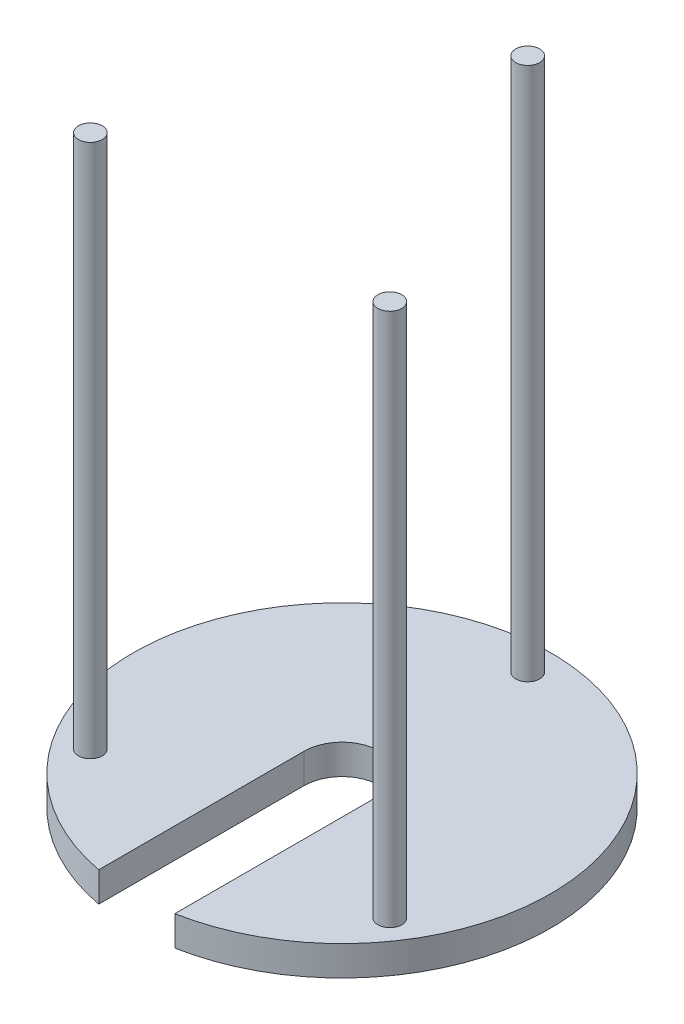
ISO-10303-21;
HEADER;
FILE_DESCRIPTION(('STEP AP214'),'2;1');
FILE_NAME('part.step','',(''),(''),'','','');
FILE_SCHEMA(('AUTOMOTIVE_DESIGN { 1 0 10303 214 1 1 1 1 }'));
ENDSEC;
DATA;
#1=APPLICATION_CONTEXT('core data for automotive mechanical design processes');
#2=APPLICATION_PROTOCOL_DEFINITION('international standard','automotive_design',2000,#1);
#3=PRODUCT_CONTEXT('',#1,'mechanical');
#4=PRODUCT('Part','Part','',(#3));
#5=PRODUCT_RELATED_PRODUCT_CATEGORY('part','',(#4));
#6=PRODUCT_DEFINITION_FORMATION('','',#4);
#7=PRODUCT_DEFINITION_CONTEXT('part definition',#1,'design');
#8=PRODUCT_DEFINITION('design','',#6,#7);
#9=PRODUCT_DEFINITION_SHAPE('','',#8);
#10=(LENGTH_UNIT() NAMED_UNIT(*) SI_UNIT(.MILLI.,.METRE.));
#11=(NAMED_UNIT(*) PLANE_ANGLE_UNIT() SI_UNIT($,.RADIAN.));
#12=(NAMED_UNIT(*) SI_UNIT($,.STERADIAN.) SOLID_ANGLE_UNIT());
#13=UNCERTAINTY_MEASURE_WITH_UNIT(LENGTH_MEASURE(1.E-05),#10,'distance_accuracy_value','');
#14=(GEOMETRIC_REPRESENTATION_CONTEXT(3) GLOBAL_UNCERTAINTY_ASSIGNED_CONTEXT((#13)) GLOBAL_UNIT_ASSIGNED_CONTEXT((#10,
#11,#12)) REPRESENTATION_CONTEXT('',''));
#15=CARTESIAN_POINT('',(0.,0.,0.));
#16=DIRECTION('',(0.,0.,1.));
#17=DIRECTION('',(1.,0.,0.));
#18=AXIS2_PLACEMENT_3D('',#15,#16,#17);
#19=CARTESIAN_POINT('',(0.,10.,0.));
#20=DIRECTION('',(0.,-1.,0.));
#21=DIRECTION('',(0.,0.,-1.));
#22=AXIS2_PLACEMENT_3D('',#19,#20,#21);
#23=CYLINDRICAL_SURFACE('',#22,70.);
#24=DIRECTION('',(0.,-1.,0.));
#25=VECTOR('',#24,1.);
#26=CARTESIAN_POINT('',(12.75,10.,68.8290454677384));
#27=LINE('',#26,#25);
#28=CARTESIAN_POINT('',(12.75,0.,68.8290454677384));
#29=VERTEX_POINT('',#28);
#30=CARTESIAN_POINT('',(12.75,10.,68.8290454677384));
#31=VERTEX_POINT('',#30);
#32=EDGE_CURVE('E116',#29,#31,#27,.F.);
#33=ORIENTED_EDGE('',*,*,#32,.F.);
#34=CARTESIAN_POINT('',(0.,0.,0.));
#35=DIRECTION('',(0.,1.,0.));
#36=DIRECTION('',(0.,0.,1.));
#37=AXIS2_PLACEMENT_3D('',#34,#35,#36);
#38=CIRCLE('',#37,70.);
#39=CARTESIAN_POINT('',(-12.75,0.,68.8290454677384));
#40=VERTEX_POINT('',#39);
#41=EDGE_CURVE('E63',#29,#40,#38,.T.);
#42=ORIENTED_EDGE('',*,*,#41,.T.);
#43=DIRECTION('',(0.,-1.,0.));
#44=VECTOR('',#43,1.);
#45=CARTESIAN_POINT('',(-12.75,10.,68.8290454677384));
#46=LINE('',#45,#44);
#47=CARTESIAN_POINT('',(-12.75,10.,68.8290454677384));
#48=VERTEX_POINT('',#47);
#49=EDGE_CURVE('E75',#40,#48,#46,.F.);
#50=ORIENTED_EDGE('',*,*,#49,.T.);
#51=CARTESIAN_POINT('',(0.,10.,0.));
#52=DIRECTION('',(0.,1.,0.));
#53=DIRECTION('',(0.,0.,1.));
#54=AXIS2_PLACEMENT_3D('',#51,#52,#53);
#55=CIRCLE('',#54,70.);
#56=EDGE_CURVE('E12',#31,#48,#55,.T.);
#57=ORIENTED_EDGE('',*,*,#56,.F.);
#58=EDGE_LOOP('',(#33,#42,#50,#57));
#59=FACE_BOUND('',#58,.T.);
#60=ADVANCED_FACE('F60',(#59),#23,.T.);
#61=CARTESIAN_POINT('',(0.,10.,0.));
#62=DIRECTION('',(0.,1.,0.));
#63=DIRECTION('',(0.,0.,1.));
#64=AXIS2_PLACEMENT_3D('',#61,#62,#63);
#65=PLANE('',#64);
#66=CARTESIAN_POINT('',(-49.2264981599708,10.,35.171037501137));
#67=DIRECTION('',(0.,1.,0.));
#68=DIRECTION('',(0.,0.,1.));
#69=AXIS2_PLACEMENT_3D('',#66,#67,#68);
#70=CIRCLE('',#69,4.00000000000001);
#71=CARTESIAN_POINT('',(-49.2264981599708,9.99999999999998,31.171037501137));
#72=VERTEX_POINT('',#71);
#73=EDGE_CURVE('E146',#72,#72,#70,.T.);
#74=ORIENTED_EDGE('',*,*,#73,.F.);
#75=EDGE_LOOP('',(#74));
#76=FACE_BOUND('',#75,.T.);
#77=CARTESIAN_POINT('',(1.7675282556702,10.,-60.5));
#78=DIRECTION('',(0.,1.,0.));
#79=DIRECTION('',(0.,0.,1.));
#80=AXIS2_PLACEMENT_3D('',#77,#78,#79);
#81=CIRCLE('',#80,4.);
#82=CARTESIAN_POINT('',(1.7675282556702,9.99999999999998,-64.5));
#83=VERTEX_POINT('',#82);
#84=EDGE_CURVE('E150',#83,#83,#81,.T.);
#85=ORIENTED_EDGE('',*,*,#84,.F.);
#86=EDGE_LOOP('',(#85));
#87=FACE_BOUND('',#86,.T.);
#88=CARTESIAN_POINT('',(50.0353405978836,10.,34.0105085415344));
#89=DIRECTION('',(0.,1.,0.));
#90=DIRECTION('',(0.,0.,1.));
#91=AXIS2_PLACEMENT_3D('',#88,#89,#90);
#92=CIRCLE('',#91,4.00000000000001);
#93=CARTESIAN_POINT('',(50.0353405978836,9.99999999999998,30.0105085415344));
#94=VERTEX_POINT('',#93);
#95=EDGE_CURVE('E158',#94,#94,#92,.T.);
#96=ORIENTED_EDGE('',*,*,#95,.F.);
#97=EDGE_LOOP('',(#96));
#98=FACE_BOUND('',#97,.T.);
#99=CARTESIAN_POINT('',(0.,10.,0.));
#100=DIRECTION('',(0.,1.,0.));
#101=DIRECTION('',(0.,0.,1.));
#102=AXIS2_PLACEMENT_3D('',#99,#100,#101);
#103=CIRCLE('',#102,12.75);
#104=CARTESIAN_POINT('',(12.75,10.,0.));
#105=VERTEX_POINT('',#104);
#106=CARTESIAN_POINT('',(-12.75,10.,0.));
#107=VERTEX_POINT('',#106);
#108=EDGE_CURVE('E106',#105,#107,#103,.T.);
#109=ORIENTED_EDGE('',*,*,#108,.F.);
#110=DIRECTION('',(0.,0.,1.));
#111=VECTOR('',#110,1.);
#112=CARTESIAN_POINT('',(12.75,10.,0.));
#113=LINE('',#112,#111);
#114=EDGE_CURVE('E114',#105,#31,#113,.T.);
#115=ORIENTED_EDGE('',*,*,#114,.T.);
#116=ORIENTED_EDGE('',*,*,#56,.T.);
#117=DIRECTION('',(0.,0.,1.));
#118=VECTOR('',#117,1.);
#119=CARTESIAN_POINT('',(-12.75,10.,0.));
#120=LINE('',#119,#118);
#121=EDGE_CURVE('E120',#107,#48,#120,.T.);
#122=ORIENTED_EDGE('',*,*,#121,.F.);
#123=EDGE_LOOP('',(#109,#115,#116,#122));
#124=FACE_BOUND('',#123,.T.);
#125=ADVANCED_FACE('F122',(#76,#87,#98,#124),#65,.T.);
#126=CARTESIAN_POINT('',(0.,0.,0.));
#127=DIRECTION('',(0.,1.,0.));
#128=DIRECTION('',(0.,0.,1.));
#129=AXIS2_PLACEMENT_3D('',#126,#127,#128);
#130=PLANE('',#129);
#131=DIRECTION('',(0.,0.,1.));
#132=VECTOR('',#131,1.);
#133=CARTESIAN_POINT('',(12.75,0.,0.));
#134=LINE('',#133,#132);
#135=CARTESIAN_POINT('',(12.75,0.,0.));
#136=VERTEX_POINT('',#135);
#137=EDGE_CURVE('E83',#136,#29,#134,.T.);
#138=ORIENTED_EDGE('',*,*,#137,.F.);
#139=CARTESIAN_POINT('',(0.,0.,0.));
#140=DIRECTION('',(0.,1.,0.));
#141=DIRECTION('',(0.,0.,1.));
#142=AXIS2_PLACEMENT_3D('',#139,#140,#141);
#143=CIRCLE('',#142,12.75);
#144=CARTESIAN_POINT('',(-12.75,0.,0.));
#145=VERTEX_POINT('',#144);
#146=EDGE_CURVE('E109',#136,#145,#143,.T.);
#147=ORIENTED_EDGE('',*,*,#146,.T.);
#148=DIRECTION('',(0.,0.,1.));
#149=VECTOR('',#148,1.);
#150=CARTESIAN_POINT('',(-12.75,0.,0.));
#151=LINE('',#150,#149);
#152=EDGE_CURVE('E124',#145,#40,#151,.T.);
#153=ORIENTED_EDGE('',*,*,#152,.T.);
#154=ORIENTED_EDGE('',*,*,#41,.F.);
#155=EDGE_LOOP('',(#138,#147,#153,#154));
#156=FACE_BOUND('',#155,.T.);
#157=ADVANCED_FACE('F171',(#156),#130,.F.);
#158=CARTESIAN_POINT('',(50.0353405978836,189.,34.0105085415344));
#159=DIRECTION('',(0.,-1.,0.));
#160=DIRECTION('',(0.,0.,-1.));
#161=AXIS2_PLACEMENT_3D('',#158,#159,#160);
#162=CYLINDRICAL_SURFACE('',#161,4.00000000000001);
#163=CARTESIAN_POINT('',(50.0353405978836,189.,34.0105085415344));
#164=DIRECTION('',(0.,1.,0.));
#165=DIRECTION('',(0.,0.,1.));
#166=AXIS2_PLACEMENT_3D('',#163,#164,#165);
#167=CIRCLE('',#166,4.00000000000001);
#168=CARTESIAN_POINT('',(50.0353405978836,189.,30.0105085415344));
#169=VERTEX_POINT('',#168);
#170=EDGE_CURVE('E141',#169,#169,#167,.T.);
#171=CARTESIAN_POINT('',(50.0353405978836,189.,30.0105085415344));
#172=CARTESIAN_POINT('',(50.0353405978836,187.135416666667,30.0105085415344));
#173=CARTESIAN_POINT('',(50.0353405978836,185.270833333333,30.0105085415344));
#174=CARTESIAN_POINT('',(50.0353405978836,181.541666666667,30.0105085415344));
#175=CARTESIAN_POINT('',(50.0353405978836,179.677083333333,30.0105085415344));
#176=CARTESIAN_POINT('',(50.0353405978836,175.947916666667,30.0105085415344));
#177=CARTESIAN_POINT('',(50.0353405978836,174.083333333333,30.0105085415344));
#178=CARTESIAN_POINT('',(50.0353405978836,170.354166666667,30.0105085415344));
#179=CARTESIAN_POINT('',(50.0353405978836,168.489583333333,30.0105085415344));
#180=CARTESIAN_POINT('',(50.0353405978836,164.760416666667,30.0105085415344));
#181=CARTESIAN_POINT('',(50.0353405978836,162.895833333333,30.0105085415344));
#182=CARTESIAN_POINT('',(50.0353405978836,159.166666666667,30.0105085415344));
#183=CARTESIAN_POINT('',(50.0353405978836,157.302083333333,30.0105085415344));
#184=CARTESIAN_POINT('',(50.0353405978836,153.572916666667,30.0105085415344));
#185=CARTESIAN_POINT('',(50.0353405978836,151.708333333333,30.0105085415344));
#186=CARTESIAN_POINT('',(50.0353405978836,147.979166666667,30.0105085415344));
#187=CARTESIAN_POINT('',(50.0353405978836,146.114583333333,30.0105085415344));
#188=CARTESIAN_POINT('',(50.0353405978836,142.385416666667,30.0105085415344));
#189=CARTESIAN_POINT('',(50.0353405978836,140.520833333333,30.0105085415344));
#190=CARTESIAN_POINT('',(50.0353405978836,136.791666666667,30.0105085415344));
#191=CARTESIAN_POINT('',(50.0353405978836,134.927083333333,30.0105085415344));
#192=CARTESIAN_POINT('',(50.0353405978836,131.197916666667,30.0105085415344));
#193=CARTESIAN_POINT('',(50.0353405978836,129.333333333333,30.0105085415344));
#194=CARTESIAN_POINT('',(50.0353405978836,125.604166666667,30.0105085415344));
#195=CARTESIAN_POINT('',(50.0353405978836,123.739583333333,30.0105085415344));
#196=CARTESIAN_POINT('',(50.0353405978836,120.010416666667,30.0105085415344));
#197=CARTESIAN_POINT('',(50.0353405978836,118.145833333333,30.0105085415344));
#198=CARTESIAN_POINT('',(50.0353405978836,114.416666666667,30.0105085415344));
#199=CARTESIAN_POINT('',(50.0353405978836,112.552083333333,30.0105085415344));
#200=CARTESIAN_POINT('',(50.0353405978836,108.822916666667,30.0105085415344));
#201=CARTESIAN_POINT('',(50.0353405978836,106.958333333333,30.0105085415344));
#202=CARTESIAN_POINT('',(50.0353405978836,103.229166666667,30.0105085415344));
#203=CARTESIAN_POINT('',(50.0353405978836,101.364583333333,30.0105085415344));
#204=CARTESIAN_POINT('',(50.0353405978836,97.6354166666666,30.0105085415344));
#205=CARTESIAN_POINT('',(50.0353405978836,95.7708333333333,30.0105085415344));
#206=CARTESIAN_POINT('',(50.0353405978836,92.0416666666666,30.0105085415344));
#207=CARTESIAN_POINT('',(50.0353405978836,90.1770833333333,30.0105085415344));
#208=CARTESIAN_POINT('',(50.0353405978836,86.4479166666666,30.0105085415344));
#209=CARTESIAN_POINT('',(50.0353405978836,84.5833333333333,30.0105085415344));
#210=CARTESIAN_POINT('',(50.0353405978836,80.8541666666666,30.0105085415344));
#211=CARTESIAN_POINT('',(50.0353405978836,78.9895833333333,30.0105085415344));
#212=CARTESIAN_POINT('',(50.0353405978836,75.2604166666666,30.0105085415344));
#213=CARTESIAN_POINT('',(50.0353405978836,73.3958333333333,30.0105085415344));
#214=CARTESIAN_POINT('',(50.0353405978836,69.6666666666666,30.0105085415344));
#215=CARTESIAN_POINT('',(50.0353405978836,67.8020833333333,30.0105085415344));
#216=CARTESIAN_POINT('',(50.0353405978836,64.0729166666666,30.0105085415344));
#217=CARTESIAN_POINT('',(50.0353405978836,62.2083333333333,30.0105085415344));
#218=CARTESIAN_POINT('',(50.0353405978836,58.4791666666667,30.0105085415344));
#219=CARTESIAN_POINT('',(50.0353405978836,56.6145833333333,30.0105085415344));
#220=CARTESIAN_POINT('',(50.0353405978836,52.8854166666667,30.0105085415344));
#221=CARTESIAN_POINT('',(50.0353405978836,51.0208333333333,30.0105085415344));
#222=CARTESIAN_POINT('',(50.0353405978836,47.2916666666667,30.0105085415344));
#223=CARTESIAN_POINT('',(50.0353405978836,45.4270833333333,30.0105085415344));
#224=CARTESIAN_POINT('',(50.0353405978836,41.6979166666667,30.0105085415344));
#225=CARTESIAN_POINT('',(50.0353405978836,39.8333333333333,30.0105085415344));
#226=CARTESIAN_POINT('',(50.0353405978836,36.1041666666667,30.0105085415344));
#227=CARTESIAN_POINT('',(50.0353405978836,34.2395833333333,30.0105085415344));
#228=CARTESIAN_POINT('',(50.0353405978836,30.5104166666667,30.0105085415344));
#229=CARTESIAN_POINT('',(50.0353405978836,28.6458333333333,30.0105085415344));
#230=CARTESIAN_POINT('',(50.0353405978836,24.9166666666667,30.0105085415344));
#231=CARTESIAN_POINT('',(50.0353405978836,23.0520833333333,30.0105085415344));
#232=CARTESIAN_POINT('',(50.0353405978836,19.3229166666667,30.0105085415344));
#233=CARTESIAN_POINT('',(50.0353405978836,17.4583333333333,30.0105085415344));
#234=CARTESIAN_POINT('',(50.0353405978836,13.7291666666667,30.0105085415344));
#235=CARTESIAN_POINT('',(50.0353405978836,11.8645833333333,30.0105085415344));
#236=CARTESIAN_POINT('',(50.0353405978836,9.99999999999998,30.0105085415344));
#237=B_SPLINE_CURVE_WITH_KNOTS('',3,(#171,#172,#173,#174,#175,#176,#177,#178,#179,#180,#181,
#182,#183,#184,#185,#186,#187,#188,#189,#190,#191,#192,#193,#194,#195,#196,#197,#198,#199,#200,
#201,#202,#203,#204,#205,#206,#207,#208,#209,#210,#211,#212,#213,#214,#215,#216,#217,#218,#219,
#220,#221,#222,#223,#224,#225,#226,#227,#228,#229,#230,#231,#232,#233,#234,#235,#236),
.UNSPECIFIED.,.F.,.F.,(4,2,2,2,2,2,2,2,2,2,2,2,2,2,2,2,2,2,2,2,2,2,2,2,2,2,2,2,2,2,2,2,4),(0.,
5.59375000000001,11.1875,16.78125,22.375,27.96875,33.5625,39.15625,44.75,50.34375,55.9375,
61.53125,67.125,72.71875,78.3125,83.90625,89.5,95.09375,100.6875,106.28125,111.875,117.46875,
123.0625,128.65625,134.25,139.84375,145.4375,151.03125,156.625,162.21875,167.8125,173.40625,
179.),.UNSPECIFIED.);
#238=EDGE_CURVE('BSEAM168',#169,#94,#237,.T.);
#239=ORIENTED_EDGE('',*,*,#170,.F.);
#240=ORIENTED_EDGE('',*,*,#95,.T.);
#241=ORIENTED_EDGE('',*,*,#238,.T.);
#242=ORIENTED_EDGE('',*,*,#238,.F.);
#243=EDGE_LOOP('',(#239,#241,#240,#242));
#244=FACE_BOUND('',#243,.T.);
#245=ADVANCED_FACE('F168',(#244),#162,.T.);
#246=CARTESIAN_POINT('',(50.0353405978836,189.,34.0105085415344));
#247=DIRECTION('',(0.,1.,0.));
#248=DIRECTION('',(0.,0.,1.));
#249=AXIS2_PLACEMENT_3D('',#246,#247,#248);
#250=PLANE('',#249);
#251=ORIENTED_EDGE('',*,*,#170,.T.);
#252=EDGE_LOOP('',(#251));
#253=FACE_BOUND('',#252,.T.);
#254=ADVANCED_FACE('F166',(#253),#250,.T.);
#255=CARTESIAN_POINT('',(1.7675282556702,189.,-60.5));
#256=DIRECTION('',(0.,-1.,0.));
#257=DIRECTION('',(0.,0.,-1.));
#258=AXIS2_PLACEMENT_3D('',#255,#256,#257);
#259=CYLINDRICAL_SURFACE('',#258,4.);
#260=CARTESIAN_POINT('',(1.7675282556702,189.,-60.5));
#261=DIRECTION('',(0.,1.,0.));
#262=DIRECTION('',(0.,0.,1.));
#263=AXIS2_PLACEMENT_3D('',#260,#261,#262);
#264=CIRCLE('',#263,4.);
#265=CARTESIAN_POINT('',(1.7675282556702,189.,-64.5));
#266=VERTEX_POINT('',#265);
#267=EDGE_CURVE('E154',#266,#266,#264,.T.);
#268=CARTESIAN_POINT('',(1.7675282556702,189.,-64.5));
#269=CARTESIAN_POINT('',(1.7675282556702,187.135416666667,-64.5));
#270=CARTESIAN_POINT('',(1.7675282556702,185.270833333333,-64.5));
#271=CARTESIAN_POINT('',(1.7675282556702,181.541666666667,-64.5));
#272=CARTESIAN_POINT('',(1.7675282556702,179.677083333333,-64.5));
#273=CARTESIAN_POINT('',(1.7675282556702,175.947916666667,-64.5));
#274=CARTESIAN_POINT('',(1.7675282556702,174.083333333333,-64.5));
#275=CARTESIAN_POINT('',(1.7675282556702,170.354166666667,-64.5));
#276=CARTESIAN_POINT('',(1.7675282556702,168.489583333333,-64.5));
#277=CARTESIAN_POINT('',(1.7675282556702,164.760416666667,-64.5));
#278=CARTESIAN_POINT('',(1.7675282556702,162.895833333333,-64.5));
#279=CARTESIAN_POINT('',(1.7675282556702,159.166666666667,-64.5));
#280=CARTESIAN_POINT('',(1.7675282556702,157.302083333333,-64.5));
#281=CARTESIAN_POINT('',(1.7675282556702,153.572916666667,-64.5));
#282=CARTESIAN_POINT('',(1.7675282556702,151.708333333333,-64.5));
#283=CARTESIAN_POINT('',(1.7675282556702,147.979166666667,-64.5));
#284=CARTESIAN_POINT('',(1.7675282556702,146.114583333333,-64.5));
#285=CARTESIAN_POINT('',(1.7675282556702,142.385416666667,-64.5));
#286=CARTESIAN_POINT('',(1.7675282556702,140.520833333333,-64.5));
#287=CARTESIAN_POINT('',(1.7675282556702,136.791666666667,-64.5));
#288=CARTESIAN_POINT('',(1.7675282556702,134.927083333333,-64.5));
#289=CARTESIAN_POINT('',(1.7675282556702,131.197916666667,-64.5));
#290=CARTESIAN_POINT('',(1.7675282556702,129.333333333333,-64.5));
#291=CARTESIAN_POINT('',(1.7675282556702,125.604166666667,-64.5));
#292=CARTESIAN_POINT('',(1.7675282556702,123.739583333333,-64.5));
#293=CARTESIAN_POINT('',(1.7675282556702,120.010416666667,-64.5));
#294=CARTESIAN_POINT('',(1.7675282556702,118.145833333333,-64.5));
#295=CARTESIAN_POINT('',(1.7675282556702,114.416666666667,-64.5));
#296=CARTESIAN_POINT('',(1.7675282556702,112.552083333333,-64.5));
#297=CARTESIAN_POINT('',(1.7675282556702,108.822916666667,-64.5));
#298=CARTESIAN_POINT('',(1.7675282556702,106.958333333333,-64.5));
#299=CARTESIAN_POINT('',(1.7675282556702,103.229166666667,-64.5));
#300=CARTESIAN_POINT('',(1.7675282556702,101.364583333333,-64.5));
#301=CARTESIAN_POINT('',(1.7675282556702,97.6354166666666,-64.5));
#302=CARTESIAN_POINT('',(1.7675282556702,95.7708333333333,-64.5));
#303=CARTESIAN_POINT('',(1.7675282556702,92.0416666666666,-64.5));
#304=CARTESIAN_POINT('',(1.7675282556702,90.1770833333333,-64.5));
#305=CARTESIAN_POINT('',(1.7675282556702,86.4479166666666,-64.5));
#306=CARTESIAN_POINT('',(1.7675282556702,84.5833333333333,-64.5));
#307=CARTESIAN_POINT('',(1.7675282556702,80.8541666666666,-64.5));
#308=CARTESIAN_POINT('',(1.7675282556702,78.9895833333333,-64.5));
#309=CARTESIAN_POINT('',(1.7675282556702,75.2604166666666,-64.5));
#310=CARTESIAN_POINT('',(1.7675282556702,73.3958333333333,-64.5));
#311=CARTESIAN_POINT('',(1.7675282556702,69.6666666666666,-64.5));
#312=CARTESIAN_POINT('',(1.7675282556702,67.8020833333333,-64.5));
#313=CARTESIAN_POINT('',(1.7675282556702,64.0729166666666,-64.5));
#314=CARTESIAN_POINT('',(1.7675282556702,62.2083333333333,-64.5));
#315=CARTESIAN_POINT('',(1.7675282556702,58.4791666666667,-64.5));
#316=CARTESIAN_POINT('',(1.7675282556702,56.6145833333333,-64.5));
#317=CARTESIAN_POINT('',(1.7675282556702,52.8854166666667,-64.5));
#318=CARTESIAN_POINT('',(1.7675282556702,51.0208333333333,-64.5));
#319=CARTESIAN_POINT('',(1.7675282556702,47.2916666666667,-64.5));
#320=CARTESIAN_POINT('',(1.7675282556702,45.4270833333333,-64.5));
#321=CARTESIAN_POINT('',(1.7675282556702,41.6979166666667,-64.5));
#322=CARTESIAN_POINT('',(1.7675282556702,39.8333333333333,-64.5));
#323=CARTESIAN_POINT('',(1.7675282556702,36.1041666666667,-64.5));
#324=CARTESIAN_POINT('',(1.7675282556702,34.2395833333333,-64.5));
#325=CARTESIAN_POINT('',(1.7675282556702,30.5104166666667,-64.5));
#326=CARTESIAN_POINT('',(1.7675282556702,28.6458333333333,-64.5));
#327=CARTESIAN_POINT('',(1.7675282556702,24.9166666666667,-64.5));
#328=CARTESIAN_POINT('',(1.7675282556702,23.0520833333333,-64.5));
#329=CARTESIAN_POINT('',(1.7675282556702,19.3229166666667,-64.5));
#330=CARTESIAN_POINT('',(1.7675282556702,17.4583333333333,-64.5));
#331=CARTESIAN_POINT('',(1.7675282556702,13.7291666666667,-64.5));
#332=CARTESIAN_POINT('',(1.7675282556702,11.8645833333333,-64.5));
#333=CARTESIAN_POINT('',(1.7675282556702,9.99999999999998,-64.5));
#334=B_SPLINE_CURVE_WITH_KNOTS('',3,(#268,#269,#270,#271,#272,#273,#274,#275,#276,#277,#278,
#279,#280,#281,#282,#283,#284,#285,#286,#287,#288,#289,#290,#291,#292,#293,#294,#295,#296,#297,
#298,#299,#300,#301,#302,#303,#304,#305,#306,#307,#308,#309,#310,#311,#312,#313,#314,#315,#316,
#317,#318,#319,#320,#321,#322,#323,#324,#325,#326,#327,#328,#329,#330,#331,#332,#333),
.UNSPECIFIED.,.F.,.F.,(4,2,2,2,2,2,2,2,2,2,2,2,2,2,2,2,2,2,2,2,2,2,2,2,2,2,2,2,2,2,2,2,4),(0.,
5.59375000000001,11.1875,16.78125,22.375,27.96875,33.5625,39.15625,44.75,50.34375,55.9375,
61.53125,67.125,72.71875,78.3125,83.90625,89.5,95.09375,100.6875,106.28125,111.875,117.46875,
123.0625,128.65625,134.25,139.84375,145.4375,151.03125,156.625,162.21875,167.8125,173.40625,
179.),.UNSPECIFIED.);
#335=EDGE_CURVE('BSEAM188',#266,#83,#334,.T.);
#336=ORIENTED_EDGE('',*,*,#267,.F.);
#337=ORIENTED_EDGE('',*,*,#84,.T.);
#338=ORIENTED_EDGE('',*,*,#335,.T.);
#339=ORIENTED_EDGE('',*,*,#335,.F.);
#340=EDGE_LOOP('',(#336,#338,#337,#339));
#341=FACE_BOUND('',#340,.T.);
#342=ADVANCED_FACE('F188',(#341),#259,.T.);
#343=CARTESIAN_POINT('',(1.7675282556702,189.,-60.5));
#344=DIRECTION('',(0.,1.,0.));
#345=DIRECTION('',(0.,0.,1.));
#346=AXIS2_PLACEMENT_3D('',#343,#344,#345);
#347=PLANE('',#346);
#348=ORIENTED_EDGE('',*,*,#267,.T.);
#349=EDGE_LOOP('',(#348));
#350=FACE_BOUND('',#349,.T.);
#351=ADVANCED_FACE('F190',(#350),#347,.T.);
#352=CARTESIAN_POINT('',(-49.2264981599708,189.,35.171037501137));
#353=DIRECTION('',(0.,-1.,0.));
#354=DIRECTION('',(0.,0.,-1.));
#355=AXIS2_PLACEMENT_3D('',#352,#353,#354);
#356=CYLINDRICAL_SURFACE('',#355,4.00000000000001);
#357=CARTESIAN_POINT('',(-49.2264981599708,189.,35.171037501137));
#358=DIRECTION('',(0.,1.,0.));
#359=DIRECTION('',(0.,0.,1.));
#360=AXIS2_PLACEMENT_3D('',#357,#358,#359);
#361=CIRCLE('',#360,4.00000000000001);
#362=CARTESIAN_POINT('',(-49.2264981599708,189.,31.171037501137));
#363=VERTEX_POINT('',#362);
#364=EDGE_CURVE('E142',#363,#363,#361,.T.);
#365=CARTESIAN_POINT('',(-49.2264981599708,189.,31.171037501137));
#366=CARTESIAN_POINT('',(-49.2264981599708,187.135416666667,31.171037501137));
#367=CARTESIAN_POINT('',(-49.2264981599708,185.270833333333,31.171037501137));
#368=CARTESIAN_POINT('',(-49.2264981599708,181.541666666667,31.171037501137));
#369=CARTESIAN_POINT('',(-49.2264981599708,179.677083333333,31.171037501137));
#370=CARTESIAN_POINT('',(-49.2264981599708,175.947916666667,31.171037501137));
#371=CARTESIAN_POINT('',(-49.2264981599708,174.083333333333,31.171037501137));
#372=CARTESIAN_POINT('',(-49.2264981599708,170.354166666667,31.171037501137));
#373=CARTESIAN_POINT('',(-49.2264981599708,168.489583333333,31.171037501137));
#374=CARTESIAN_POINT('',(-49.2264981599708,164.760416666667,31.171037501137));
#375=CARTESIAN_POINT('',(-49.2264981599708,162.895833333333,31.171037501137));
#376=CARTESIAN_POINT('',(-49.2264981599708,159.166666666667,31.171037501137));
#377=CARTESIAN_POINT('',(-49.2264981599708,157.302083333333,31.171037501137));
#378=CARTESIAN_POINT('',(-49.2264981599708,153.572916666667,31.171037501137));
#379=CARTESIAN_POINT('',(-49.2264981599708,151.708333333333,31.171037501137));
#380=CARTESIAN_POINT('',(-49.2264981599708,147.979166666667,31.171037501137));
#381=CARTESIAN_POINT('',(-49.2264981599708,146.114583333333,31.171037501137));
#382=CARTESIAN_POINT('',(-49.2264981599708,142.385416666667,31.171037501137));
#383=CARTESIAN_POINT('',(-49.2264981599708,140.520833333333,31.171037501137));
#384=CARTESIAN_POINT('',(-49.2264981599708,136.791666666667,31.171037501137));
#385=CARTESIAN_POINT('',(-49.2264981599708,134.927083333333,31.171037501137));
#386=CARTESIAN_POINT('',(-49.2264981599708,131.197916666667,31.171037501137));
#387=CARTESIAN_POINT('',(-49.2264981599708,129.333333333333,31.171037501137));
#388=CARTESIAN_POINT('',(-49.2264981599708,125.604166666667,31.171037501137));
#389=CARTESIAN_POINT('',(-49.2264981599708,123.739583333333,31.171037501137));
#390=CARTESIAN_POINT('',(-49.2264981599708,120.010416666667,31.171037501137));
#391=CARTESIAN_POINT('',(-49.2264981599708,118.145833333333,31.171037501137));
#392=CARTESIAN_POINT('',(-49.2264981599708,114.416666666667,31.171037501137));
#393=CARTESIAN_POINT('',(-49.2264981599708,112.552083333333,31.171037501137));
#394=CARTESIAN_POINT('',(-49.2264981599708,108.822916666667,31.171037501137));
#395=CARTESIAN_POINT('',(-49.2264981599708,106.958333333333,31.171037501137));
#396=CARTESIAN_POINT('',(-49.2264981599708,103.229166666667,31.171037501137));
#397=CARTESIAN_POINT('',(-49.2264981599708,101.364583333333,31.171037501137));
#398=CARTESIAN_POINT('',(-49.2264981599708,97.6354166666666,31.171037501137));
#399=CARTESIAN_POINT('',(-49.2264981599708,95.7708333333333,31.171037501137));
#400=CARTESIAN_POINT('',(-49.2264981599708,92.0416666666666,31.171037501137));
#401=CARTESIAN_POINT('',(-49.2264981599708,90.1770833333333,31.171037501137));
#402=CARTESIAN_POINT('',(-49.2264981599708,86.4479166666666,31.171037501137));
#403=CARTESIAN_POINT('',(-49.2264981599708,84.5833333333333,31.171037501137));
#404=CARTESIAN_POINT('',(-49.2264981599708,80.8541666666666,31.171037501137));
#405=CARTESIAN_POINT('',(-49.2264981599708,78.9895833333333,31.171037501137));
#406=CARTESIAN_POINT('',(-49.2264981599708,75.2604166666666,31.171037501137));
#407=CARTESIAN_POINT('',(-49.2264981599708,73.3958333333333,31.171037501137));
#408=CARTESIAN_POINT('',(-49.2264981599708,69.6666666666666,31.171037501137));
#409=CARTESIAN_POINT('',(-49.2264981599708,67.8020833333333,31.171037501137));
#410=CARTESIAN_POINT('',(-49.2264981599708,64.0729166666666,31.171037501137));
#411=CARTESIAN_POINT('',(-49.2264981599708,62.2083333333333,31.171037501137));
#412=CARTESIAN_POINT('',(-49.2264981599708,58.4791666666667,31.171037501137));
#413=CARTESIAN_POINT('',(-49.2264981599708,56.6145833333333,31.171037501137));
#414=CARTESIAN_POINT('',(-49.2264981599708,52.8854166666667,31.171037501137));
#415=CARTESIAN_POINT('',(-49.2264981599708,51.0208333333333,31.171037501137));
#416=CARTESIAN_POINT('',(-49.2264981599708,47.2916666666667,31.171037501137));
#417=CARTESIAN_POINT('',(-49.2264981599708,45.4270833333333,31.171037501137));
#418=CARTESIAN_POINT('',(-49.2264981599708,41.6979166666667,31.171037501137));
#419=CARTESIAN_POINT('',(-49.2264981599708,39.8333333333333,31.171037501137));
#420=CARTESIAN_POINT('',(-49.2264981599708,36.1041666666667,31.171037501137));
#421=CARTESIAN_POINT('',(-49.2264981599708,34.2395833333333,31.171037501137));
#422=CARTESIAN_POINT('',(-49.2264981599708,30.5104166666667,31.171037501137));
#423=CARTESIAN_POINT('',(-49.2264981599708,28.6458333333333,31.171037501137));
#424=CARTESIAN_POINT('',(-49.2264981599708,24.9166666666667,31.171037501137));
#425=CARTESIAN_POINT('',(-49.2264981599708,23.0520833333333,31.171037501137));
#426=CARTESIAN_POINT('',(-49.2264981599708,19.3229166666667,31.171037501137));
#427=CARTESIAN_POINT('',(-49.2264981599708,17.4583333333333,31.171037501137));
#428=CARTESIAN_POINT('',(-49.2264981599708,13.7291666666667,31.171037501137));
#429=CARTESIAN_POINT('',(-49.2264981599708,11.8645833333333,31.171037501137));
#430=CARTESIAN_POINT('',(-49.2264981599708,9.99999999999998,31.171037501137));
#431=B_SPLINE_CURVE_WITH_KNOTS('',3,(#365,#366,#367,#368,#369,#370,#371,#372,#373,#374,#375,
#376,#377,#378,#379,#380,#381,#382,#383,#384,#385,#386,#387,#388,#389,#390,#391,#392,#393,#394,
#395,#396,#397,#398,#399,#400,#401,#402,#403,#404,#405,#406,#407,#408,#409,#410,#411,#412,#413,
#414,#415,#416,#417,#418,#419,#420,#421,#422,#423,#424,#425,#426,#427,#428,#429,#430),
.UNSPECIFIED.,.F.,.F.,(4,2,2,2,2,2,2,2,2,2,2,2,2,2,2,2,2,2,2,2,2,2,2,2,2,2,2,2,2,2,2,2,4),(0.,
5.59375000000001,11.1875,16.78125,22.375,27.96875,33.5625,39.15625,44.75,50.34375,55.9375,
61.53125,67.125,72.71875,78.3125,83.90625,89.5,95.09375,100.6875,106.28125,111.875,117.46875,
123.0625,128.65625,134.25,139.84375,145.4375,151.03125,156.625,162.21875,167.8125,173.40625,
179.),.UNSPECIFIED.);
#432=EDGE_CURVE('BSEAM193',#363,#72,#431,.T.);
#433=ORIENTED_EDGE('',*,*,#364,.F.);
#434=ORIENTED_EDGE('',*,*,#73,.T.);
#435=ORIENTED_EDGE('',*,*,#432,.T.);
#436=ORIENTED_EDGE('',*,*,#432,.F.);
#437=EDGE_LOOP('',(#433,#435,#434,#436));
#438=FACE_BOUND('',#437,.T.);
#439=ADVANCED_FACE('F193',(#438),#356,.T.);
#440=CARTESIAN_POINT('',(-49.2264981599708,189.,35.171037501137));
#441=DIRECTION('',(0.,1.,0.));
#442=DIRECTION('',(0.,0.,1.));
#443=AXIS2_PLACEMENT_3D('',#440,#441,#442);
#444=PLANE('',#443);
#445=ORIENTED_EDGE('',*,*,#364,.T.);
#446=EDGE_LOOP('',(#445));
#447=FACE_BOUND('',#446,.T.);
#448=ADVANCED_FACE('F200',(#447),#444,.T.);
#449=CARTESIAN_POINT('',(12.75,0.,0.));
#450=DIRECTION('',(-1.,0.,0.));
#451=DIRECTION('',(0.,0.,1.));
#452=AXIS2_PLACEMENT_3D('',#449,#450,#451);
#453=PLANE('',#452);
#454=ORIENTED_EDGE('',*,*,#32,.T.);
#455=ORIENTED_EDGE('',*,*,#114,.F.);
#456=DIRECTION('',(0.,1.,0.));
#457=VECTOR('',#456,1.);
#458=CARTESIAN_POINT('',(12.75,0.,0.));
#459=LINE('',#458,#457);
#460=EDGE_CURVE('E102',#105,#136,#459,.F.);
#461=ORIENTED_EDGE('',*,*,#460,.T.);
#462=ORIENTED_EDGE('',*,*,#137,.T.);
#463=EDGE_LOOP('',(#454,#455,#461,#462));
#464=FACE_BOUND('',#463,.T.);
#465=ADVANCED_FACE('F115',(#464),#453,.T.);
#466=CARTESIAN_POINT('',(-12.75,0.,0.));
#467=DIRECTION('',(-1.,0.,0.));
#468=DIRECTION('',(0.,0.,1.));
#469=AXIS2_PLACEMENT_3D('',#466,#467,#468);
#470=PLANE('',#469);
#471=ORIENTED_EDGE('',*,*,#152,.F.);
#472=DIRECTION('',(0.,1.,0.));
#473=VECTOR('',#472,1.);
#474=CARTESIAN_POINT('',(-12.75,0.,0.));
#475=LINE('',#474,#473);
#476=EDGE_CURVE('E111',#107,#145,#475,.F.);
#477=ORIENTED_EDGE('',*,*,#476,.F.);
#478=ORIENTED_EDGE('',*,*,#121,.T.);
#479=ORIENTED_EDGE('',*,*,#49,.F.);
#480=EDGE_LOOP('',(#471,#477,#478,#479));
#481=FACE_BOUND('',#480,.T.);
#482=ADVANCED_FACE('F207',(#481),#470,.F.);
#483=CARTESIAN_POINT('',(0.,0.,0.));
#484=DIRECTION('',(0.,1.,0.));
#485=DIRECTION('',(0.,0.,1.));
#486=AXIS2_PLACEMENT_3D('',#483,#484,#485);
#487=CYLINDRICAL_SURFACE('',#486,12.75);
#488=ORIENTED_EDGE('',*,*,#108,.T.);
#489=ORIENTED_EDGE('',*,*,#476,.T.);
#490=ORIENTED_EDGE('',*,*,#146,.F.);
#491=ORIENTED_EDGE('',*,*,#460,.F.);
#492=EDGE_LOOP('',(#488,#489,#490,#491));
#493=FACE_BOUND('',#492,.T.);
#494=ADVANCED_FACE('F104',(#493),#487,.F.);
#495=CLOSED_SHELL('',(#60,#125,#157,#245,#254,#342,#351,#439,#448,#465,#482,#494));
#496=MANIFOLD_SOLID_BREP('B2',#495);
#497=ADVANCED_BREP_SHAPE_REPRESENTATION('',(#18,#496),#14);
#498=SHAPE_DEFINITION_REPRESENTATION(#9,#497);
ENDSEC;
END-ISO-10303-21;
